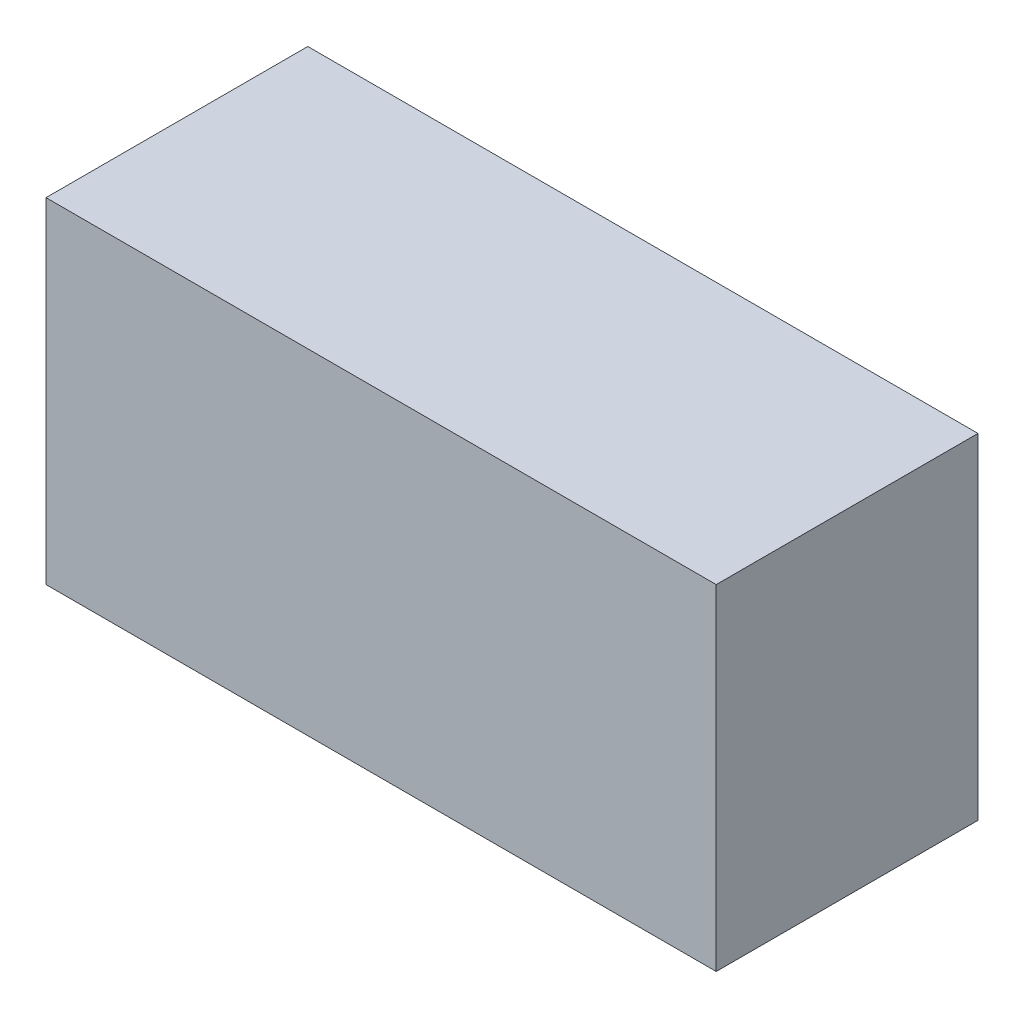
ISO-10303-21;
HEADER;
FILE_DESCRIPTION(('STEP AP214'),'2;1');
FILE_NAME('part.step','',(''),(''),'','','');
FILE_SCHEMA(('AUTOMOTIVE_DESIGN { 1 0 10303 214 1 1 1 1 }'));
ENDSEC;
DATA;
#1=APPLICATION_CONTEXT('core data for automotive mechanical design processes');
#2=APPLICATION_PROTOCOL_DEFINITION('international standard','automotive_design',2000,#1);
#3=PRODUCT_CONTEXT('',#1,'mechanical');
#4=PRODUCT('Part','Part','',(#3));
#5=PRODUCT_RELATED_PRODUCT_CATEGORY('part','',(#4));
#6=PRODUCT_DEFINITION_FORMATION('','',#4);
#7=PRODUCT_DEFINITION_CONTEXT('part definition',#1,'design');
#8=PRODUCT_DEFINITION('design','',#6,#7);
#9=PRODUCT_DEFINITION_SHAPE('','',#8);
#10=(LENGTH_UNIT() NAMED_UNIT(*) SI_UNIT(.MILLI.,.METRE.));
#11=(NAMED_UNIT(*) PLANE_ANGLE_UNIT() SI_UNIT($,.RADIAN.));
#12=(NAMED_UNIT(*) SI_UNIT($,.STERADIAN.) SOLID_ANGLE_UNIT());
#13=UNCERTAINTY_MEASURE_WITH_UNIT(LENGTH_MEASURE(1.E-05),#10,'distance_accuracy_value','');
#14=(GEOMETRIC_REPRESENTATION_CONTEXT(3) GLOBAL_UNCERTAINTY_ASSIGNED_CONTEXT((#13)) GLOBAL_UNIT_ASSIGNED_CONTEXT((#10,
#11,#12)) REPRESENTATION_CONTEXT('',''));
#15=CARTESIAN_POINT('',(0.,0.,0.));
#16=DIRECTION('',(0.,0.,1.));
#17=DIRECTION('',(1.,0.,0.));
#18=AXIS2_PLACEMENT_3D('',#15,#16,#17);
#19=CARTESIAN_POINT('',(-1.59999934,0.80000094,1.25));
#20=DIRECTION('',(0.,0.,-1.));
#21=DIRECTION('',(-1.,0.,0.));
#22=AXIS2_PLACEMENT_3D('',#19,#20,#21);
#23=PLANE('',#22);
#24=DIRECTION('',(1.,0.,0.));
#25=VECTOR('',#24,1.);
#26=CARTESIAN_POINT('',(-1.59999934,-0.80000094,1.25));
#27=LINE('',#26,#25);
#28=CARTESIAN_POINT('',(-1.59999934,-0.80000094,1.25));
#29=VERTEX_POINT('',#28);
#30=CARTESIAN_POINT('',(1.60000188,-0.80000094,1.25));
#31=VERTEX_POINT('',#30);
#32=EDGE_CURVE('E55',#29,#31,#27,.T.);
#33=ORIENTED_EDGE('',*,*,#32,.T.);
#34=DIRECTION('',(0.,1.,0.));
#35=VECTOR('',#34,1.);
#36=CARTESIAN_POINT('',(1.60000188,-0.80000094,1.25));
#37=LINE('',#36,#35);
#38=CARTESIAN_POINT('',(1.60000188,0.80000094,1.25));
#39=VERTEX_POINT('',#38);
#40=EDGE_CURVE('E58',#31,#39,#37,.T.);
#41=ORIENTED_EDGE('',*,*,#40,.T.);
#42=DIRECTION('',(1.,0.,0.));
#43=VECTOR('',#42,1.);
#44=CARTESIAN_POINT('',(1.60000188,0.80000094,1.25));
#45=LINE('',#44,#43);
#46=CARTESIAN_POINT('',(-1.59999934,0.80000094,1.25));
#47=VERTEX_POINT('',#46);
#48=EDGE_CURVE('E60',#39,#47,#45,.F.);
#49=ORIENTED_EDGE('',*,*,#48,.T.);
#50=DIRECTION('',(0.,1.,0.));
#51=VECTOR('',#50,1.);
#52=CARTESIAN_POINT('',(-1.59999934,0.80000094,1.25));
#53=LINE('',#52,#51);
#54=EDGE_CURVE('E20',#29,#47,#53,.T.);
#55=ORIENTED_EDGE('',*,*,#54,.F.);
#56=EDGE_LOOP('',(#33,#41,#49,#55));
#57=FACE_BOUND('',#56,.T.);
#58=ADVANCED_FACE('F17',(#57),#23,.F.);
#59=CARTESIAN_POINT('',(1.60000188,0.80000094,0.));
#60=DIRECTION('',(0.,-1.,0.));
#61=DIRECTION('',(0.,0.,-1.));
#62=AXIS2_PLACEMENT_3D('',#59,#60,#61);
#63=PLANE('',#62);
#64=DIRECTION('',(0.,0.,-1.));
#65=VECTOR('',#64,1.);
#66=CARTESIAN_POINT('',(-1.59999934,0.80000094,0.));
#67=LINE('',#66,#65);
#68=CARTESIAN_POINT('',(-1.59999934,0.80000094,0.));
#69=VERTEX_POINT('',#68);
#70=EDGE_CURVE('E71',#69,#47,#67,.F.);
#71=ORIENTED_EDGE('',*,*,#70,.T.);
#72=ORIENTED_EDGE('',*,*,#48,.F.);
#73=DIRECTION('',(0.,0.,1.));
#74=VECTOR('',#73,1.);
#75=CARTESIAN_POINT('',(1.60000188,0.80000094,0.));
#76=LINE('',#75,#74);
#77=CARTESIAN_POINT('',(1.60000188,0.80000094,0.));
#78=VERTEX_POINT('',#77);
#79=EDGE_CURVE('E65',#39,#78,#76,.F.);
#80=ORIENTED_EDGE('',*,*,#79,.T.);
#81=DIRECTION('',(-1.,0.,0.));
#82=VECTOR('',#81,1.);
#83=CARTESIAN_POINT('',(-1.59999934,0.80000094,0.));
#84=LINE('',#83,#82);
#85=EDGE_CURVE('E83',#69,#78,#84,.F.);
#86=ORIENTED_EDGE('',*,*,#85,.F.);
#87=EDGE_LOOP('',(#71,#72,#80,#86));
#88=FACE_BOUND('',#87,.T.);
#89=ADVANCED_FACE('F68',(#88),#63,.F.);
#90=CARTESIAN_POINT('',(1.60000188,-0.80000094,0.));
#91=DIRECTION('',(-1.,0.,0.));
#92=DIRECTION('',(0.,0.,1.));
#93=AXIS2_PLACEMENT_3D('',#90,#91,#92);
#94=PLANE('',#93);
#95=ORIENTED_EDGE('',*,*,#79,.F.);
#96=ORIENTED_EDGE('',*,*,#40,.F.);
#97=DIRECTION('',(0.,0.,1.));
#98=VECTOR('',#97,1.);
#99=CARTESIAN_POINT('',(1.60000188,-0.80000094,0.));
#100=LINE('',#99,#98);
#101=CARTESIAN_POINT('',(1.60000188,-0.80000094,0.));
#102=VERTEX_POINT('',#101);
#103=EDGE_CURVE('E77',#31,#102,#100,.F.);
#104=ORIENTED_EDGE('',*,*,#103,.T.);
#105=DIRECTION('',(0.,1.,0.));
#106=VECTOR('',#105,1.);
#107=CARTESIAN_POINT('',(1.60000188,0.80000094,0.));
#108=LINE('',#107,#106);
#109=EDGE_CURVE('E74',#78,#102,#108,.F.);
#110=ORIENTED_EDGE('',*,*,#109,.F.);
#111=EDGE_LOOP('',(#95,#96,#104,#110));
#112=FACE_BOUND('',#111,.T.);
#113=ADVANCED_FACE('F72',(#112),#94,.F.);
#114=CARTESIAN_POINT('',(-1.59999934,-0.80000094,0.));
#115=DIRECTION('',(0.,1.,0.));
#116=DIRECTION('',(0.,0.,1.));
#117=AXIS2_PLACEMENT_3D('',#114,#115,#116);
#118=PLANE('',#117);
#119=ORIENTED_EDGE('',*,*,#103,.F.);
#120=ORIENTED_EDGE('',*,*,#32,.F.);
#121=DIRECTION('',(0.,0.,-1.));
#122=VECTOR('',#121,1.);
#123=CARTESIAN_POINT('',(-1.59999934,-0.80000094,0.));
#124=LINE('',#123,#122);
#125=CARTESIAN_POINT('',(-1.59999934,-0.80000094,0.));
#126=VERTEX_POINT('',#125);
#127=EDGE_CURVE('E35',#29,#126,#124,.T.);
#128=ORIENTED_EDGE('',*,*,#127,.T.);
#129=DIRECTION('',(-1.,0.,0.));
#130=VECTOR('',#129,1.);
#131=CARTESIAN_POINT('',(-1.59999934,-0.80000094,0.));
#132=LINE('',#131,#130);
#133=EDGE_CURVE('E26',#102,#126,#132,.T.);
#134=ORIENTED_EDGE('',*,*,#133,.F.);
#135=EDGE_LOOP('',(#119,#120,#128,#134));
#136=FACE_BOUND('',#135,.T.);
#137=ADVANCED_FACE('F89',(#136),#118,.F.);
#138=CARTESIAN_POINT('',(-1.59999934,0.80000094,0.));
#139=DIRECTION('',(1.,0.,0.));
#140=DIRECTION('',(0.,0.,-1.));
#141=AXIS2_PLACEMENT_3D('',#138,#139,#140);
#142=PLANE('',#141);
#143=ORIENTED_EDGE('',*,*,#127,.F.);
#144=ORIENTED_EDGE('',*,*,#54,.T.);
#145=ORIENTED_EDGE('',*,*,#70,.F.);
#146=DIRECTION('',(0.,1.,0.));
#147=VECTOR('',#146,1.);
#148=CARTESIAN_POINT('',(-1.59999934,0.80000094,0.));
#149=LINE('',#148,#147);
#150=EDGE_CURVE('E11',#126,#69,#149,.T.);
#151=ORIENTED_EDGE('',*,*,#150,.F.);
#152=EDGE_LOOP('',(#143,#144,#145,#151));
#153=FACE_BOUND('',#152,.T.);
#154=ADVANCED_FACE('F91',(#153),#142,.F.);
#155=CARTESIAN_POINT('',(-1.59999934,0.80000094,0.));
#156=DIRECTION('',(0.,0.,-1.));
#157=DIRECTION('',(-1.,0.,0.));
#158=AXIS2_PLACEMENT_3D('',#155,#156,#157);
#159=PLANE('',#158);
#160=ORIENTED_EDGE('',*,*,#133,.T.);
#161=ORIENTED_EDGE('',*,*,#150,.T.);
#162=ORIENTED_EDGE('',*,*,#85,.T.);
#163=ORIENTED_EDGE('',*,*,#109,.T.);
#164=EDGE_LOOP('',(#160,#161,#162,#163));
#165=FACE_BOUND('',#164,.T.);
#166=ADVANCED_FACE('F88',(#165),#159,.T.);
#167=CLOSED_SHELL('',(#58,#89,#113,#137,#154,#166));
#168=MANIFOLD_SOLID_BREP('B1',#167);
#169=ADVANCED_BREP_SHAPE_REPRESENTATION('',(#18,#168),#14);
#170=SHAPE_DEFINITION_REPRESENTATION(#9,#169);
ENDSEC;
END-ISO-10303-21;
